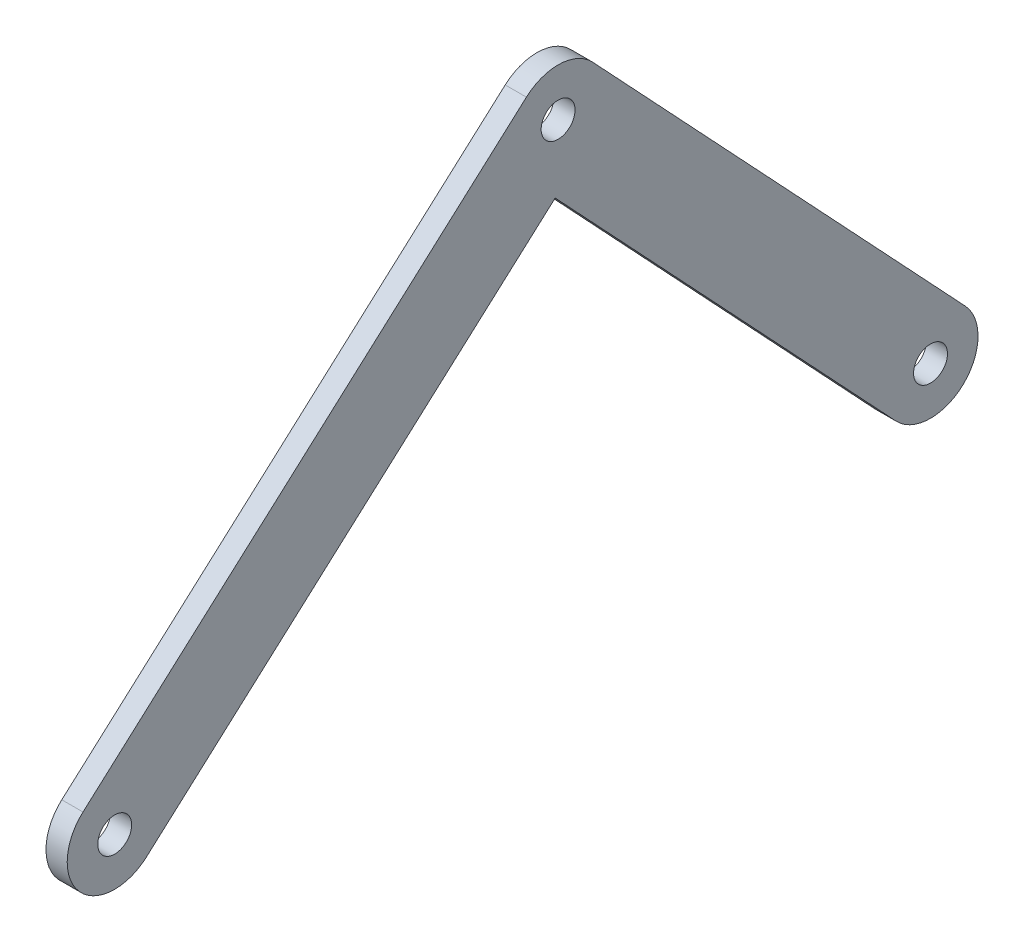
ISO-10303-21;
HEADER;
FILE_DESCRIPTION(('STEP AP214'),'2;1');
FILE_NAME('part.step','',(''),(''),'','','');
FILE_SCHEMA(('AUTOMOTIVE_DESIGN { 1 0 10303 214 1 1 1 1 }'));
ENDSEC;
DATA;
#1=APPLICATION_CONTEXT('core data for automotive mechanical design processes');
#2=APPLICATION_PROTOCOL_DEFINITION('international standard','automotive_design',2000,#1);
#3=PRODUCT_CONTEXT('',#1,'mechanical');
#4=PRODUCT('Part','Part','',(#3));
#5=PRODUCT_RELATED_PRODUCT_CATEGORY('part','',(#4));
#6=PRODUCT_DEFINITION_FORMATION('','',#4);
#7=PRODUCT_DEFINITION_CONTEXT('part definition',#1,'design');
#8=PRODUCT_DEFINITION('design','',#6,#7);
#9=PRODUCT_DEFINITION_SHAPE('','',#8);
#10=(LENGTH_UNIT() NAMED_UNIT(*) SI_UNIT(.MILLI.,.METRE.));
#11=(NAMED_UNIT(*) PLANE_ANGLE_UNIT() SI_UNIT($,.RADIAN.));
#12=(NAMED_UNIT(*) SI_UNIT($,.STERADIAN.) SOLID_ANGLE_UNIT());
#13=UNCERTAINTY_MEASURE_WITH_UNIT(LENGTH_MEASURE(1.E-05),#10,'distance_accuracy_value','');
#14=(GEOMETRIC_REPRESENTATION_CONTEXT(3) GLOBAL_UNCERTAINTY_ASSIGNED_CONTEXT((#13)) GLOBAL_UNIT_ASSIGNED_CONTEXT((#10,
#11,#12)) REPRESENTATION_CONTEXT('',''));
#15=CARTESIAN_POINT('',(0.,0.,0.));
#16=DIRECTION('',(0.,0.,1.));
#17=DIRECTION('',(1.,0.,0.));
#18=AXIS2_PLACEMENT_3D('',#15,#16,#17);
#19=CARTESIAN_POINT('',(3.175,4.86353011462833,-5.18908651152623));
#20=DIRECTION('',(0.,0.683848441314444,-0.729624087672416));
#21=DIRECTION('',(0.,0.729624087672416,0.683848441314444));
#22=AXIS2_PLACEMENT_3D('',#19,#20,#21);
#23=PLANE('',#22);
#24=DIRECTION('',(0.,-0.729624087672416,-0.683848441314444));
#25=VECTOR('',#24,1.);
#26=CARTESIAN_POINT('',(0.,4.86353011462833,-5.18908651152623));
#27=LINE('',#26,#25);
#28=CARTESIAN_POINT('',(0.,4.86353011462832,-5.18908651152622));
#29=VERTEX_POINT('',#28);
#30=CARTESIAN_POINT('',(0.,-54.6488166973717,-60.9677077138226));
#31=VERTEX_POINT('',#30);
#32=EDGE_CURVE('E139',#29,#31,#27,.T.);
#33=ORIENTED_EDGE('',*,*,#32,.F.);
#34=DIRECTION('',(-1.,0.,0.));
#35=VECTOR('',#34,1.);
#36=CARTESIAN_POINT('',(3.175,4.86353011462832,-5.18908651152622));
#37=LINE('',#36,#35);
#38=CARTESIAN_POINT('',(3.175,4.86353011462832,-5.18908651152622));
#39=VERTEX_POINT('',#38);
#40=EDGE_CURVE('E11',#39,#29,#37,.T.);
#41=ORIENTED_EDGE('',*,*,#40,.F.);
#42=DIRECTION('',(0.,-0.729624087672416,-0.683848441314444));
#43=VECTOR('',#42,1.);
#44=CARTESIAN_POINT('',(3.175,4.86353011462833,-5.18908651152623));
#45=LINE('',#44,#43);
#46=CARTESIAN_POINT('',(3.175,-54.6488166973717,-60.9677077138226));
#47=VERTEX_POINT('',#46);
#48=EDGE_CURVE('E161',#39,#47,#45,.T.);
#49=ORIENTED_EDGE('',*,*,#48,.T.);
#50=DIRECTION('',(-1.,0.,0.));
#51=VECTOR('',#50,1.);
#52=CARTESIAN_POINT('',(3.175,-54.6488166973717,-60.9677077138226));
#53=LINE('',#52,#51);
#54=EDGE_CURVE('E93',#47,#31,#53,.T.);
#55=ORIENTED_EDGE('',*,*,#54,.T.);
#56=EDGE_LOOP('',(#33,#41,#49,#55));
#57=FACE_BOUND('',#56,.T.);
#58=ADVANCED_FACE('F45',(#57),#23,.T.);
#59=CARTESIAN_POINT('',(3.175,0.,0.));
#60=DIRECTION('',(-1.,0.,0.));
#61=DIRECTION('',(0.,0.,1.));
#62=AXIS2_PLACEMENT_3D('',#59,#60,#61);
#63=CYLINDRICAL_SURFACE('',#62,7.112);
#64=CARTESIAN_POINT('',(0.,0.,0.));
#65=DIRECTION('',(1.,0.,0.));
#66=DIRECTION('',(0.,0.,-1.));
#67=AXIS2_PLACEMENT_3D('',#64,#65,#66);
#68=CIRCLE('',#67,7.112);
#69=CARTESIAN_POINT('',(0.,5.29638022770035,4.7464618910958));
#70=VERTEX_POINT('',#69);
#71=EDGE_CURVE('E143',#29,#70,#68,.T.);
#72=ORIENTED_EDGE('',*,*,#71,.T.);
#73=DIRECTION('',(-1.,0.,0.));
#74=VECTOR('',#73,1.);
#75=CARTESIAN_POINT('',(3.175,5.29638022770035,4.7464618910958));
#76=LINE('',#75,#74);
#77=CARTESIAN_POINT('',(3.175,5.29638022770035,4.7464618910958));
#78=VERTEX_POINT('',#77);
#79=EDGE_CURVE('E54',#78,#70,#76,.T.);
#80=ORIENTED_EDGE('',*,*,#79,.F.);
#81=CARTESIAN_POINT('',(3.175,0.,0.));
#82=DIRECTION('',(1.,0.,0.));
#83=DIRECTION('',(0.,0.,-1.));
#84=AXIS2_PLACEMENT_3D('',#81,#82,#83);
#85=CIRCLE('',#84,7.112);
#86=EDGE_CURVE('E203',#39,#78,#85,.T.);
#87=ORIENTED_EDGE('',*,*,#86,.F.);
#88=ORIENTED_EDGE('',*,*,#40,.T.);
#89=EDGE_LOOP('',(#72,#80,#87,#88));
#90=FACE_BOUND('',#89,.T.);
#91=ADVANCED_FACE('F193',(#90),#63,.T.);
#92=CARTESIAN_POINT('',(3.175,5.29638022770032,4.74646189109583));
#93=DIRECTION('',(0.,-0.744710380722767,-0.667387779962857));
#94=DIRECTION('',(0.,0.667387779962857,-0.744710380722768));
#95=AXIS2_PLACEMENT_3D('',#92,#93,#94);
#96=PLANE('',#95);
#97=DIRECTION('',(0.,-0.667387779962857,0.744710380722768));
#98=VECTOR('',#97,1.);
#99=CARTESIAN_POINT('',(0.,5.29638022770032,4.74646189109583));
#100=LINE('',#99,#98);
#101=CARTESIAN_POINT('',(0.,-54.2159665842997,71.1538247207486));
#102=VERTEX_POINT('',#101);
#103=EDGE_CURVE('E147',#70,#102,#100,.T.);
#104=ORIENTED_EDGE('',*,*,#103,.T.);
#105=DIRECTION('',(-1.,0.,0.));
#106=VECTOR('',#105,1.);
#107=CARTESIAN_POINT('',(3.175,-54.2159665842997,71.1538247207486));
#108=LINE('',#107,#106);
#109=CARTESIAN_POINT('',(3.175,-54.2159665842997,71.1538247207486));
#110=VERTEX_POINT('',#109);
#111=EDGE_CURVE('E168',#110,#102,#108,.T.);
#112=ORIENTED_EDGE('',*,*,#111,.F.);
#113=DIRECTION('',(0.,-0.667387779962857,0.744710380722768));
#114=VECTOR('',#113,1.);
#115=CARTESIAN_POINT('',(3.175,5.29638022770032,4.74646189109583));
#116=LINE('',#115,#114);
#117=EDGE_CURVE('E133',#78,#110,#116,.T.);
#118=ORIENTED_EDGE('',*,*,#117,.F.);
#119=ORIENTED_EDGE('',*,*,#79,.T.);
#120=EDGE_LOOP('',(#104,#112,#118,#119));
#121=FACE_BOUND('',#120,.T.);
#122=ADVANCED_FACE('F177',(#121),#96,.F.);
#123=CARTESIAN_POINT('',(3.175,-59.512346812,66.4073628296528));
#124=DIRECTION('',(-1.,0.,0.));
#125=DIRECTION('',(0.,0.,1.));
#126=AXIS2_PLACEMENT_3D('',#123,#124,#125);
#127=CYLINDRICAL_SURFACE('',#126,7.112);
#128=CARTESIAN_POINT('',(0.,-59.512346812,66.4073628296528));
#129=DIRECTION('',(1.,0.,0.));
#130=DIRECTION('',(0.,0.,-1.));
#131=AXIS2_PLACEMENT_3D('',#128,#129,#130);
#132=CIRCLE('',#131,7.112);
#133=CARTESIAN_POINT('',(0.,-64.8087270397003,61.660900938557));
#134=VERTEX_POINT('',#133);
#135=EDGE_CURVE('E150',#102,#134,#132,.T.);
#136=ORIENTED_EDGE('',*,*,#135,.T.);
#137=DIRECTION('',(-1.,0.,0.));
#138=VECTOR('',#137,1.);
#139=CARTESIAN_POINT('',(3.175,-64.8087270397003,61.660900938557));
#140=LINE('',#139,#138);
#141=CARTESIAN_POINT('',(3.175,-64.8087270397003,61.660900938557));
#142=VERTEX_POINT('',#141);
#143=EDGE_CURVE('E119',#142,#134,#140,.T.);
#144=ORIENTED_EDGE('',*,*,#143,.F.);
#145=CARTESIAN_POINT('',(3.175,-59.512346812,66.4073628296528));
#146=DIRECTION('',(1.,0.,0.));
#147=DIRECTION('',(0.,0.,-1.));
#148=AXIS2_PLACEMENT_3D('',#145,#146,#147);
#149=CIRCLE('',#148,7.112);
#150=EDGE_CURVE('E128',#110,#142,#149,.T.);
#151=ORIENTED_EDGE('',*,*,#150,.F.);
#152=ORIENTED_EDGE('',*,*,#111,.T.);
#153=EDGE_LOOP('',(#136,#144,#151,#152));
#154=FACE_BOUND('',#153,.T.);
#155=ADVANCED_FACE('F185',(#154),#127,.T.);
#156=CARTESIAN_POINT('',(3.175,-5.29638022770033,-4.74646189109584));
#157=DIRECTION('',(0.,-0.744710380722767,-0.667387779962857));
#158=DIRECTION('',(0.,0.667387779962857,-0.744710380722768));
#159=AXIS2_PLACEMENT_3D('',#156,#157,#158);
#160=PLANE('',#159);
#161=DIRECTION('',(0.,-0.667387779962857,0.744710380722768));
#162=VECTOR('',#161,1.);
#163=CARTESIAN_POINT('',(0.,-5.29638022770033,-4.74646189109584));
#164=LINE('',#163,#162);
#165=CARTESIAN_POINT('',(0.,-9.93802570204169,0.432958038602673));
#166=VERTEX_POINT('',#165);
#167=EDGE_CURVE('E117',#166,#134,#164,.T.);
#168=ORIENTED_EDGE('',*,*,#167,.F.);
#169=DIRECTION('',(-1.,0.,0.));
#170=VECTOR('',#169,1.);
#171=CARTESIAN_POINT('',(3.175,-9.93802570204169,0.432958038602673));
#172=LINE('',#171,#170);
#173=CARTESIAN_POINT('',(3.175,-9.93802570204169,0.432958038602673));
#174=VERTEX_POINT('',#173);
#175=EDGE_CURVE('E111',#174,#166,#172,.T.);
#176=ORIENTED_EDGE('',*,*,#175,.F.);
#177=DIRECTION('',(0.,-0.667387779962857,0.744710380722768));
#178=VECTOR('',#177,1.);
#179=CARTESIAN_POINT('',(3.175,-5.29638022770033,-4.74646189109584));
#180=LINE('',#179,#178);
#181=EDGE_CURVE('E115',#174,#142,#180,.T.);
#182=ORIENTED_EDGE('',*,*,#181,.T.);
#183=ORIENTED_EDGE('',*,*,#143,.T.);
#184=EDGE_LOOP('',(#168,#176,#182,#183));
#185=FACE_BOUND('',#184,.T.);
#186=ADVANCED_FACE('F113',(#185),#160,.T.);
#187=CARTESIAN_POINT('',(3.175,-4.86353011462832,5.18908651152623));
#188=DIRECTION('',(0.,0.683848441314444,-0.729624087672416));
#189=DIRECTION('',(0.,0.729624087672416,0.683848441314444));
#190=AXIS2_PLACEMENT_3D('',#187,#188,#189);
#191=PLANE('',#190);
#192=DIRECTION('',(0.,-0.729624087672416,-0.683848441314444));
#193=VECTOR('',#192,1.);
#194=CARTESIAN_POINT('',(0.,-4.86353011462832,5.18908651152623));
#195=LINE('',#194,#193);
#196=CARTESIAN_POINT('',(0.,-64.3758769266283,-50.5895346907701));
#197=VERTEX_POINT('',#196);
#198=EDGE_CURVE('E86',#166,#197,#195,.T.);
#199=ORIENTED_EDGE('',*,*,#198,.T.);
#200=DIRECTION('',(-1.,0.,0.));
#201=VECTOR('',#200,1.);
#202=CARTESIAN_POINT('',(3.175,-64.3758769266283,-50.5895346907701));
#203=LINE('',#202,#201);
#204=CARTESIAN_POINT('',(3.175,-64.3758769266283,-50.5895346907701));
#205=VERTEX_POINT('',#204);
#206=EDGE_CURVE('E120',#205,#197,#203,.T.);
#207=ORIENTED_EDGE('',*,*,#206,.F.);
#208=DIRECTION('',(0.,-0.729624087672416,-0.683848441314444));
#209=VECTOR('',#208,1.);
#210=CARTESIAN_POINT('',(3.175,-4.86353011462832,5.18908651152623));
#211=LINE('',#210,#209);
#212=EDGE_CURVE('E122',#174,#205,#211,.T.);
#213=ORIENTED_EDGE('',*,*,#212,.F.);
#214=ORIENTED_EDGE('',*,*,#175,.T.);
#215=EDGE_LOOP('',(#199,#207,#213,#214));
#216=FACE_BOUND('',#215,.T.);
#217=ADVANCED_FACE('F123',(#216),#191,.F.);
#218=CARTESIAN_POINT('',(3.175,-59.512346812,-55.7786212022964));
#219=DIRECTION('',(-1.,0.,0.));
#220=DIRECTION('',(0.,0.,1.));
#221=AXIS2_PLACEMENT_3D('',#218,#219,#220);
#222=CYLINDRICAL_SURFACE('',#221,7.11200000000001);
#223=CARTESIAN_POINT('',(0.,-59.512346812,-55.7786212022964));
#224=DIRECTION('',(1.,0.,0.));
#225=DIRECTION('',(0.,0.,-1.));
#226=AXIS2_PLACEMENT_3D('',#223,#224,#225);
#227=CIRCLE('',#226,7.11200000000001);
#228=EDGE_CURVE('E158',#197,#31,#227,.T.);
#229=ORIENTED_EDGE('',*,*,#228,.T.);
#230=ORIENTED_EDGE('',*,*,#54,.F.);
#231=CARTESIAN_POINT('',(3.175,-59.512346812,-55.7786212022964));
#232=DIRECTION('',(1.,0.,0.));
#233=DIRECTION('',(0.,0.,-1.));
#234=AXIS2_PLACEMENT_3D('',#231,#232,#233);
#235=CIRCLE('',#234,7.11200000000001);
#236=EDGE_CURVE('E62',#205,#47,#235,.T.);
#237=ORIENTED_EDGE('',*,*,#236,.F.);
#238=ORIENTED_EDGE('',*,*,#206,.T.);
#239=EDGE_LOOP('',(#229,#230,#237,#238));
#240=FACE_BOUND('',#239,.T.);
#241=ADVANCED_FACE('F201',(#240),#222,.T.);
#242=CARTESIAN_POINT('',(3.175,0.,0.));
#243=DIRECTION('',(1.,0.,0.));
#244=DIRECTION('',(0.,0.,-1.));
#245=AXIS2_PLACEMENT_3D('',#242,#243,#244);
#246=PLANE('',#245);
#247=CARTESIAN_POINT('',(3.175,0.,0.));
#248=DIRECTION('',(1.,0.,0.));
#249=DIRECTION('',(0.,0.,-1.));
#250=AXIS2_PLACEMENT_3D('',#247,#248,#249);
#251=CIRCLE('',#250,2.54);
#252=CARTESIAN_POINT('',(3.175,0.,-2.54));
#253=VERTEX_POINT('',#252);
#254=EDGE_CURVE('E225',#253,#253,#251,.T.);
#255=ORIENTED_EDGE('',*,*,#254,.F.);
#256=EDGE_LOOP('',(#255));
#257=FACE_BOUND('',#256,.T.);
#258=CARTESIAN_POINT('',(3.175,-59.512346812,66.4073628296528));
#259=DIRECTION('',(1.,0.,0.));
#260=DIRECTION('',(0.,0.,-1.));
#261=AXIS2_PLACEMENT_3D('',#258,#259,#260);
#262=CIRCLE('',#261,2.54);
#263=CARTESIAN_POINT('',(3.175,-59.512346812,63.8673628296528));
#264=VERTEX_POINT('',#263);
#265=EDGE_CURVE('E221',#264,#264,#262,.T.);
#266=ORIENTED_EDGE('',*,*,#265,.F.);
#267=EDGE_LOOP('',(#266));
#268=FACE_BOUND('',#267,.T.);
#269=CARTESIAN_POINT('',(3.175,-59.512346812,-55.7786212022964));
#270=DIRECTION('',(1.,0.,0.));
#271=DIRECTION('',(0.,0.,-1.));
#272=AXIS2_PLACEMENT_3D('',#269,#270,#271);
#273=CIRCLE('',#272,2.54);
#274=CARTESIAN_POINT('',(3.175,-59.512346812,-58.3186212022964));
#275=VERTEX_POINT('',#274);
#276=EDGE_CURVE('E213',#275,#275,#273,.T.);
#277=ORIENTED_EDGE('',*,*,#276,.F.);
#278=EDGE_LOOP('',(#277));
#279=FACE_BOUND('',#278,.T.);
#280=ORIENTED_EDGE('',*,*,#48,.F.);
#281=ORIENTED_EDGE('',*,*,#86,.T.);
#282=ORIENTED_EDGE('',*,*,#117,.T.);
#283=ORIENTED_EDGE('',*,*,#150,.T.);
#284=ORIENTED_EDGE('',*,*,#181,.F.);
#285=ORIENTED_EDGE('',*,*,#212,.T.);
#286=ORIENTED_EDGE('',*,*,#236,.T.);
#287=EDGE_LOOP('',(#280,#281,#282,#283,#284,#285,#286));
#288=FACE_BOUND('',#287,.T.);
#289=ADVANCED_FACE('F126',(#257,#268,#279,#288),#246,.T.);
#290=CARTESIAN_POINT('',(0.,0.,0.));
#291=DIRECTION('',(1.,0.,0.));
#292=DIRECTION('',(0.,0.,-1.));
#293=AXIS2_PLACEMENT_3D('',#290,#291,#292);
#294=PLANE('',#293);
#295=CARTESIAN_POINT('',(0.,0.,0.));
#296=DIRECTION('',(1.,0.,0.));
#297=DIRECTION('',(0.,0.,-1.));
#298=AXIS2_PLACEMENT_3D('',#295,#296,#297);
#299=CIRCLE('',#298,2.54);
#300=CARTESIAN_POINT('',(0.,0.,-2.54));
#301=VERTEX_POINT('',#300);
#302=EDGE_CURVE('E144',#301,#301,#299,.T.);
#303=ORIENTED_EDGE('',*,*,#302,.T.);
#304=EDGE_LOOP('',(#303));
#305=FACE_BOUND('',#304,.T.);
#306=CARTESIAN_POINT('',(0.,-59.512346812,66.4073628296528));
#307=DIRECTION('',(1.,0.,0.));
#308=DIRECTION('',(0.,0.,-1.));
#309=AXIS2_PLACEMENT_3D('',#306,#307,#308);
#310=CIRCLE('',#309,2.54);
#311=CARTESIAN_POINT('',(0.,-59.512346812,63.8673628296528));
#312=VERTEX_POINT('',#311);
#313=EDGE_CURVE('E217',#312,#312,#310,.T.);
#314=ORIENTED_EDGE('',*,*,#313,.T.);
#315=EDGE_LOOP('',(#314));
#316=FACE_BOUND('',#315,.T.);
#317=CARTESIAN_POINT('',(0.,-59.512346812,-55.7786212022964));
#318=DIRECTION('',(1.,0.,0.));
#319=DIRECTION('',(0.,0.,-1.));
#320=AXIS2_PLACEMENT_3D('',#317,#318,#319);
#321=CIRCLE('',#320,2.54);
#322=CARTESIAN_POINT('',(0.,-59.512346812,-58.3186212022964));
#323=VERTEX_POINT('',#322);
#324=EDGE_CURVE('E208',#323,#323,#321,.T.);
#325=ORIENTED_EDGE('',*,*,#324,.T.);
#326=EDGE_LOOP('',(#325));
#327=FACE_BOUND('',#326,.T.);
#328=ORIENTED_EDGE('',*,*,#32,.T.);
#329=ORIENTED_EDGE('',*,*,#228,.F.);
#330=ORIENTED_EDGE('',*,*,#198,.F.);
#331=ORIENTED_EDGE('',*,*,#167,.T.);
#332=ORIENTED_EDGE('',*,*,#135,.F.);
#333=ORIENTED_EDGE('',*,*,#103,.F.);
#334=ORIENTED_EDGE('',*,*,#71,.F.);
#335=EDGE_LOOP('',(#328,#329,#330,#331,#332,#333,#334));
#336=FACE_BOUND('',#335,.T.);
#337=ADVANCED_FACE('F183',(#305,#316,#327,#336),#294,.F.);
#338=CARTESIAN_POINT('',(0.,-59.512346812,-55.7786212022964));
#339=DIRECTION('',(1.,0.,0.));
#340=DIRECTION('',(0.,0.,-1.));
#341=AXIS2_PLACEMENT_3D('',#338,#339,#340);
#342=CYLINDRICAL_SURFACE('',#341,2.54);
#343=ORIENTED_EDGE('',*,*,#324,.F.);
#344=EDGE_LOOP('',(#343));
#345=FACE_BOUND('',#344,.T.);
#346=ORIENTED_EDGE('',*,*,#276,.T.);
#347=EDGE_LOOP('',(#346));
#348=FACE_BOUND('',#347,.T.);
#349=ADVANCED_FACE('F249',(#345,#348),#342,.F.);
#350=CARTESIAN_POINT('',(0.,-59.512346812,66.4073628296528));
#351=DIRECTION('',(1.,0.,0.));
#352=DIRECTION('',(0.,0.,-1.));
#353=AXIS2_PLACEMENT_3D('',#350,#351,#352);
#354=CYLINDRICAL_SURFACE('',#353,2.54);
#355=ORIENTED_EDGE('',*,*,#313,.F.);
#356=EDGE_LOOP('',(#355));
#357=FACE_BOUND('',#356,.T.);
#358=ORIENTED_EDGE('',*,*,#265,.T.);
#359=EDGE_LOOP('',(#358));
#360=FACE_BOUND('',#359,.T.);
#361=ADVANCED_FACE('F238',(#357,#360),#354,.F.);
#362=CARTESIAN_POINT('',(0.,0.,0.));
#363=DIRECTION('',(1.,0.,0.));
#364=DIRECTION('',(0.,0.,-1.));
#365=AXIS2_PLACEMENT_3D('',#362,#363,#364);
#366=CYLINDRICAL_SURFACE('',#365,2.54);
#367=ORIENTED_EDGE('',*,*,#302,.F.);
#368=EDGE_LOOP('',(#367));
#369=FACE_BOUND('',#368,.T.);
#370=ORIENTED_EDGE('',*,*,#254,.T.);
#371=EDGE_LOOP('',(#370));
#372=FACE_BOUND('',#371,.T.);
#373=ADVANCED_FACE('F235',(#369,#372),#366,.F.);
#374=CLOSED_SHELL('',(#58,#91,#122,#155,#186,#217,#241,#289,#337,#349,#361,#373));
#375=MANIFOLD_SOLID_BREP('B2',#374);
#376=ADVANCED_BREP_SHAPE_REPRESENTATION('',(#18,#375),#14);
#377=SHAPE_DEFINITION_REPRESENTATION(#9,#376);
ENDSEC;
END-ISO-10303-21;
